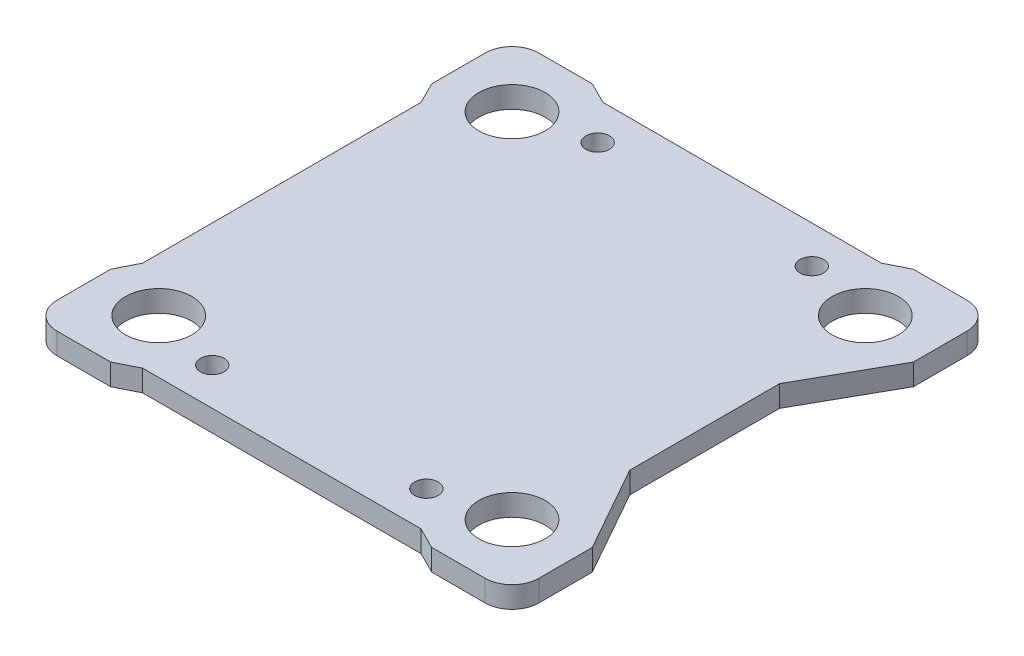
ISO-10303-21;
HEADER;
FILE_DESCRIPTION(('STEP AP214'),'2;1');
FILE_NAME('part.step','',(''),(''),'','','');
FILE_SCHEMA(('AUTOMOTIVE_DESIGN { 1 0 10303 214 1 1 1 1 }'));
ENDSEC;
DATA;
#1=APPLICATION_CONTEXT('core data for automotive mechanical design processes');
#2=APPLICATION_PROTOCOL_DEFINITION('international standard','automotive_design',2000,#1);
#3=PRODUCT_CONTEXT('',#1,'mechanical');
#4=PRODUCT('Part','Part','',(#3));
#5=PRODUCT_RELATED_PRODUCT_CATEGORY('part','',(#4));
#6=PRODUCT_DEFINITION_FORMATION('','',#4);
#7=PRODUCT_DEFINITION_CONTEXT('part definition',#1,'design');
#8=PRODUCT_DEFINITION('design','',#6,#7);
#9=PRODUCT_DEFINITION_SHAPE('','',#8);
#10=(LENGTH_UNIT() NAMED_UNIT(*) SI_UNIT(.MILLI.,.METRE.));
#11=(NAMED_UNIT(*) PLANE_ANGLE_UNIT() SI_UNIT($,.RADIAN.));
#12=(NAMED_UNIT(*) SI_UNIT($,.STERADIAN.) SOLID_ANGLE_UNIT());
#13=UNCERTAINTY_MEASURE_WITH_UNIT(LENGTH_MEASURE(1.E-05),#10,'distance_accuracy_value','');
#14=(GEOMETRIC_REPRESENTATION_CONTEXT(3) GLOBAL_UNCERTAINTY_ASSIGNED_CONTEXT((#13)) GLOBAL_UNIT_ASSIGNED_CONTEXT((#10,
#11,#12)) REPRESENTATION_CONTEXT('',''));
#15=CARTESIAN_POINT('',(0.,0.,0.));
#16=DIRECTION('',(0.,0.,1.));
#17=DIRECTION('',(1.,0.,0.));
#18=AXIS2_PLACEMENT_3D('',#15,#16,#17);
#19=CARTESIAN_POINT('',(0.,2.,0.));
#20=DIRECTION('',(0.,-1.,0.));
#21=DIRECTION('',(0.,0.,-1.));
#22=AXIS2_PLACEMENT_3D('',#19,#20,#21);
#23=PLANE('',#22);
#24=CARTESIAN_POINT('',(-8.2277397260271,2.,-12.4905821917808));
#25=DIRECTION('',(0.,1.,0.));
#26=DIRECTION('',(0.,0.,1.));
#27=AXIS2_PLACEMENT_3D('',#24,#25,#26);
#28=CIRCLE('',#27,1.09999999999999);
#29=CARTESIAN_POINT('',(-8.2277397260271,2.,-11.3905821917808));
#30=VERTEX_POINT('',#29);
#31=EDGE_CURVE('E514',#30,#30,#28,.T.);
#32=ORIENTED_EDGE('',*,*,#31,.F.);
#33=EDGE_LOOP('',(#32));
#34=FACE_BOUND('',#33,.T.);
#35=CARTESIAN_POINT('',(11.7722602739729,2.,-12.4905821917808));
#36=DIRECTION('',(0.,1.,0.));
#37=DIRECTION('',(0.,0.,1.));
#38=AXIS2_PLACEMENT_3D('',#35,#36,#37);
#39=CIRCLE('',#38,1.09999999999999);
#40=CARTESIAN_POINT('',(11.7722602739729,2.,-11.3905821917808));
#41=VERTEX_POINT('',#40);
#42=EDGE_CURVE('E508',#41,#41,#39,.T.);
#43=ORIENTED_EDGE('',*,*,#42,.F.);
#44=EDGE_LOOP('',(#43));
#45=FACE_BOUND('',#44,.T.);
#46=CARTESIAN_POINT('',(-8.2277397260271,2.,23.5094178082199));
#47=DIRECTION('',(0.,1.,0.));
#48=DIRECTION('',(0.,0.,1.));
#49=AXIS2_PLACEMENT_3D('',#46,#47,#48);
#50=CIRCLE('',#49,1.09999999999999);
#51=CARTESIAN_POINT('',(-8.2277397260271,2.,24.6094178082198));
#52=VERTEX_POINT('',#51);
#53=EDGE_CURVE('E502',#52,#52,#50,.T.);
#54=ORIENTED_EDGE('',*,*,#53,.F.);
#55=EDGE_LOOP('',(#54));
#56=FACE_BOUND('',#55,.T.);
#57=CARTESIAN_POINT('',(11.7722602739729,2.,23.5094178082199));
#58=DIRECTION('',(0.,1.,0.));
#59=DIRECTION('',(0.,0.,1.));
#60=AXIS2_PLACEMENT_3D('',#57,#58,#59);
#61=CIRCLE('',#60,1.09999999999999);
#62=CARTESIAN_POINT('',(11.7722602739729,2.,24.6094178082198));
#63=VERTEX_POINT('',#62);
#64=EDGE_CURVE('E496',#63,#63,#61,.T.);
#65=ORIENTED_EDGE('',*,*,#64,.F.);
#66=EDGE_LOOP('',(#65));
#67=FACE_BOUND('',#66,.T.);
#68=CARTESIAN_POINT('',(-14.7277397260274,2.,-10.9905821917808));
#69=DIRECTION('',(0.,1.,0.));
#70=DIRECTION('',(0.,0.,1.));
#71=AXIS2_PLACEMENT_3D('',#68,#69,#70);
#72=CIRCLE('',#71,3.1);
#73=CARTESIAN_POINT('',(-14.7277397260274,2.,-7.89058219178082));
#74=VERTEX_POINT('',#73);
#75=EDGE_CURVE('E338',#74,#74,#72,.T.);
#76=ORIENTED_EDGE('',*,*,#75,.F.);
#77=EDGE_LOOP('',(#76));
#78=FACE_BOUND('',#77,.T.);
#79=CARTESIAN_POINT('',(18.2722602739726,2.,-10.9905821917812));
#80=DIRECTION('',(0.,1.,0.));
#81=DIRECTION('',(0.,0.,1.));
#82=AXIS2_PLACEMENT_3D('',#79,#80,#81);
#83=CIRCLE('',#82,3.1);
#84=CARTESIAN_POINT('',(18.2722602739726,2.,-7.89058219178122));
#85=VERTEX_POINT('',#84);
#86=EDGE_CURVE('E339',#85,#85,#83,.T.);
#87=ORIENTED_EDGE('',*,*,#86,.F.);
#88=EDGE_LOOP('',(#87));
#89=FACE_BOUND('',#88,.T.);
#90=CARTESIAN_POINT('',(18.272260273973,2.,22.0094178082188));
#91=DIRECTION('',(0.,1.,0.));
#92=DIRECTION('',(0.,0.,1.));
#93=AXIS2_PLACEMENT_3D('',#90,#91,#92);
#94=CIRCLE('',#93,3.1);
#95=CARTESIAN_POINT('',(18.272260273973,2.,25.1094178082188));
#96=VERTEX_POINT('',#95);
#97=EDGE_CURVE('E345',#96,#96,#94,.T.);
#98=ORIENTED_EDGE('',*,*,#97,.F.);
#99=EDGE_LOOP('',(#98));
#100=FACE_BOUND('',#99,.T.);
#101=CARTESIAN_POINT('',(-14.7277397260271,2.,22.009417808219));
#102=DIRECTION('',(0.,1.,0.));
#103=DIRECTION('',(0.,0.,1.));
#104=AXIS2_PLACEMENT_3D('',#101,#102,#103);
#105=CIRCLE('',#104,3.1);
#106=CARTESIAN_POINT('',(-14.7277397260271,2.,25.109417808219));
#107=VERTEX_POINT('',#106);
#108=EDGE_CURVE('E351',#107,#107,#105,.T.);
#109=ORIENTED_EDGE('',*,*,#108,.F.);
#110=EDGE_LOOP('',(#109));
#111=FACE_BOUND('',#110,.T.);
#112=DIRECTION('',(0.490261239632588,0.,-0.871575537124533));
#113=VECTOR('',#112,1.);
#114=CARTESIAN_POINT('',(19.7722602739725,2.,-1.49058219178046));
#115=LINE('',#114,#113);
#116=CARTESIAN_POINT('',(19.7722602739725,2.,-1.49058219178046));
#117=VERTEX_POINT('',#116);
#118=CARTESIAN_POINT('',(24.2722602739728,2.,-9.49058219178045));
#119=VERTEX_POINT('',#118);
#120=EDGE_CURVE('E180',#117,#119,#115,.T.);
#121=ORIENTED_EDGE('',*,*,#120,.T.);
#122=DIRECTION('',(0.,0.,1.));
#123=VECTOR('',#122,1.);
#124=CARTESIAN_POINT('',(24.2722602739726,2.,-16.9905821917808));
#125=LINE('',#124,#123);
#126=CARTESIAN_POINT('',(24.2722602739726,2.,-14.4905821917808));
#127=VERTEX_POINT('',#126);
#128=EDGE_CURVE('E195',#127,#119,#125,.T.);
#129=ORIENTED_EDGE('',*,*,#128,.F.);
#130=CARTESIAN_POINT('',(21.7722602739726,2.,-14.4905821917808));
#131=DIRECTION('',(0.,-1.,0.));
#132=DIRECTION('',(0.,0.,-1.));
#133=AXIS2_PLACEMENT_3D('',#130,#131,#132);
#134=CIRCLE('',#133,2.5);
#135=CARTESIAN_POINT('',(21.7722602739726,2.,-16.9905821917808));
#136=VERTEX_POINT('',#135);
#137=EDGE_CURVE('E262',#127,#136,#134,.F.);
#138=ORIENTED_EDGE('',*,*,#137,.T.);
#139=DIRECTION('',(1.,0.,0.));
#140=VECTOR('',#139,1.);
#141=CARTESIAN_POINT('',(-20.7277397260274,2.,-16.9905821917808));
#142=LINE('',#141,#140);
#143=CARTESIAN_POINT('',(16.7722602739729,2.,-16.9905821917806));
#144=VERTEX_POINT('',#143);
#145=EDGE_CURVE('E206',#144,#136,#142,.T.);
#146=ORIENTED_EDGE('',*,*,#145,.F.);
#147=DIRECTION('',(0.89442719099992,0.,-0.44721359549995));
#148=VECTOR('',#147,1.);
#149=CARTESIAN_POINT('',(14.7722602739729,2.,-15.9905821917806));
#150=LINE('',#149,#148);
#151=CARTESIAN_POINT('',(14.7722602739729,2.,-15.9905821917806));
#152=VERTEX_POINT('',#151);
#153=EDGE_CURVE('E321',#152,#144,#150,.T.);
#154=ORIENTED_EDGE('',*,*,#153,.F.);
#155=DIRECTION('',(1.,0.,0.));
#156=VECTOR('',#155,1.);
#157=CARTESIAN_POINT('',(14.7722602739729,2.,-15.9905821917806));
#158=LINE('',#157,#156);
#159=CARTESIAN_POINT('',(-11.2277397260271,2.,-15.9905821917808));
#160=VERTEX_POINT('',#159);
#161=EDGE_CURVE('E188',#160,#152,#158,.T.);
#162=ORIENTED_EDGE('',*,*,#161,.F.);
#163=DIRECTION('',(0.894427190999913,0.,0.447213595499965));
#164=VECTOR('',#163,1.);
#165=CARTESIAN_POINT('',(-11.2277397260271,2.,-15.9905821917808));
#166=LINE('',#165,#164);
#167=CARTESIAN_POINT('',(-13.2277397260271,2.,-16.9905821917808));
#168=VERTEX_POINT('',#167);
#169=EDGE_CURVE('E312',#168,#160,#166,.T.);
#170=ORIENTED_EDGE('',*,*,#169,.F.);
#171=CARTESIAN_POINT('',(-18.2277397260274,2.,-16.9905821917808));
#172=VERTEX_POINT('',#171);
#173=EDGE_CURVE('E209',#172,#168,#142,.T.);
#174=ORIENTED_EDGE('',*,*,#173,.F.);
#175=CARTESIAN_POINT('',(-18.2277397260274,2.,-14.4905821917808));
#176=DIRECTION('',(0.,-1.,0.));
#177=DIRECTION('',(0.,0.,-1.));
#178=AXIS2_PLACEMENT_3D('',#175,#176,#177);
#179=CIRCLE('',#178,2.5);
#180=CARTESIAN_POINT('',(-20.7277397260274,2.,-14.4905821917808));
#181=VERTEX_POINT('',#180);
#182=EDGE_CURVE('E255',#172,#181,#179,.F.);
#183=ORIENTED_EDGE('',*,*,#182,.T.);
#184=DIRECTION('',(0.,0.,1.));
#185=VECTOR('',#184,1.);
#186=CARTESIAN_POINT('',(-20.7277397260274,2.,-16.9905821917808));
#187=LINE('',#186,#185);
#188=CARTESIAN_POINT('',(-20.7277397260271,2.,-9.4905821917809));
#189=VERTEX_POINT('',#188);
#190=EDGE_CURVE('E217',#181,#189,#187,.T.);
#191=ORIENTED_EDGE('',*,*,#190,.T.);
#192=DIRECTION('',(-0.447213595499953,0.,-0.894427190999919));
#193=VECTOR('',#192,1.);
#194=CARTESIAN_POINT('',(-19.7277397260272,2.,-7.4905821917809));
#195=LINE('',#194,#193);
#196=CARTESIAN_POINT('',(-19.7277397260272,2.,-7.4905821917809));
#197=VERTEX_POINT('',#196);
#198=EDGE_CURVE('E296',#197,#189,#195,.T.);
#199=ORIENTED_EDGE('',*,*,#198,.F.);
#200=DIRECTION('',(0.,0.,-1.));
#201=VECTOR('',#200,1.);
#202=CARTESIAN_POINT('',(-19.7277397260272,2.,-7.4905821917809));
#203=LINE('',#202,#201);
#204=CARTESIAN_POINT('',(-19.7277397260273,2.,18.5094178082191));
#205=VERTEX_POINT('',#204);
#206=EDGE_CURVE('E293',#205,#197,#203,.T.);
#207=ORIENTED_EDGE('',*,*,#206,.F.);
#208=DIRECTION('',(0.447213595499962,0.,-0.894427190999914));
#209=VECTOR('',#208,1.);
#210=CARTESIAN_POINT('',(-19.7277397260273,2.,18.5094178082191));
#211=LINE('',#210,#209);
#212=CARTESIAN_POINT('',(-20.7277397260273,2.,20.5094178082191));
#213=VERTEX_POINT('',#212);
#214=EDGE_CURVE('E289',#213,#205,#211,.T.);
#215=ORIENTED_EDGE('',*,*,#214,.F.);
#216=CARTESIAN_POINT('',(-20.7277397260274,2.,25.5094178082192));
#217=VERTEX_POINT('',#216);
#218=EDGE_CURVE('E216',#213,#217,#187,.T.);
#219=ORIENTED_EDGE('',*,*,#218,.T.);
#220=CARTESIAN_POINT('',(-18.2277397260274,2.,25.5094178082192));
#221=DIRECTION('',(0.,-1.,0.));
#222=DIRECTION('',(0.,0.,-1.));
#223=AXIS2_PLACEMENT_3D('',#220,#221,#222);
#224=CIRCLE('',#223,2.5);
#225=CARTESIAN_POINT('',(-18.2277397260274,2.,28.0094178082192));
#226=VERTEX_POINT('',#225);
#227=EDGE_CURVE('E257',#217,#226,#224,.F.);
#228=ORIENTED_EDGE('',*,*,#227,.T.);
#229=DIRECTION('',(1.,0.,0.));
#230=VECTOR('',#229,1.);
#231=CARTESIAN_POINT('',(-20.7277397260274,2.,28.0094178082192));
#232=LINE('',#231,#230);
#233=CARTESIAN_POINT('',(-13.2277397260274,2.,28.0094178082192));
#234=VERTEX_POINT('',#233);
#235=EDGE_CURVE('E211',#226,#234,#232,.T.);
#236=ORIENTED_EDGE('',*,*,#235,.T.);
#237=DIRECTION('',(-0.894427190999917,0.,0.447213595499956));
#238=VECTOR('',#237,1.);
#239=CARTESIAN_POINT('',(-11.2277397260274,2.,27.0094178082192));
#240=LINE('',#239,#238);
#241=CARTESIAN_POINT('',(-11.2277397260274,2.,27.0094178082192));
#242=VERTEX_POINT('',#241);
#243=EDGE_CURVE('E472',#242,#234,#240,.T.);
#244=ORIENTED_EDGE('',*,*,#243,.F.);
#245=DIRECTION('',(-1.,0.,0.));
#246=VECTOR('',#245,1.);
#247=CARTESIAN_POINT('',(-11.2277397260274,2.,27.0094178082192));
#248=LINE('',#247,#246);
#249=CARTESIAN_POINT('',(14.7722602739726,2.,27.0094178082192));
#250=VERTEX_POINT('',#249);
#251=EDGE_CURVE('E478',#250,#242,#248,.T.);
#252=ORIENTED_EDGE('',*,*,#251,.F.);
#253=DIRECTION('',(-0.894427190999916,0.,-0.447213595499959));
#254=VECTOR('',#253,1.);
#255=CARTESIAN_POINT('',(14.7722602739726,2.,27.0094178082192));
#256=LINE('',#255,#254);
#257=CARTESIAN_POINT('',(16.7722602739726,2.,28.0094178082192));
#258=VERTEX_POINT('',#257);
#259=EDGE_CURVE('E303',#258,#250,#256,.T.);
#260=ORIENTED_EDGE('',*,*,#259,.F.);
#261=CARTESIAN_POINT('',(21.7722602739726,2.,28.0094178082192));
#262=VERTEX_POINT('',#261);
#263=EDGE_CURVE('E236',#258,#262,#232,.T.);
#264=ORIENTED_EDGE('',*,*,#263,.T.);
#265=CARTESIAN_POINT('',(21.7722602739726,2.,25.5094178082192));
#266=DIRECTION('',(0.,-1.,0.));
#267=DIRECTION('',(0.,0.,-1.));
#268=AXIS2_PLACEMENT_3D('',#265,#266,#267);
#269=CIRCLE('',#268,2.5);
#270=CARTESIAN_POINT('',(24.2722602739726,2.,25.5094178082192));
#271=VERTEX_POINT('',#270);
#272=EDGE_CURVE('E259',#262,#271,#269,.F.);
#273=ORIENTED_EDGE('',*,*,#272,.T.);
#274=CARTESIAN_POINT('',(24.2722602739724,2.,20.5094178082195));
#275=VERTEX_POINT('',#274);
#276=EDGE_CURVE('E207',#275,#271,#125,.T.);
#277=ORIENTED_EDGE('',*,*,#276,.F.);
#278=DIRECTION('',(-0.490261239632556,0.,-0.871575537124551));
#279=VECTOR('',#278,1.);
#280=CARTESIAN_POINT('',(24.2722602739724,2.,20.5094178082195));
#281=LINE('',#280,#279);
#282=CARTESIAN_POINT('',(19.7722602739725,2.,12.5094178082195));
#283=VERTEX_POINT('',#282);
#284=EDGE_CURVE('E200',#275,#283,#281,.T.);
#285=ORIENTED_EDGE('',*,*,#284,.T.);
#286=DIRECTION('',(0.,0.,-1.));
#287=VECTOR('',#286,1.);
#288=CARTESIAN_POINT('',(19.7722602739725,2.,12.5094178082195));
#289=LINE('',#288,#287);
#290=EDGE_CURVE('E199',#283,#117,#289,.T.);
#291=ORIENTED_EDGE('',*,*,#290,.T.);
#292=EDGE_LOOP('',(#121,#129,#138,#146,#154,#162,#170,#174,#183,#191,#199,#207,#215,#219,#228,
#236,#244,#252,#260,#264,#273,#277,#285,#291));
#293=FACE_BOUND('',#292,.T.);
#294=ADVANCED_FACE('F16',(#34,#45,#56,#67,#78,#89,#100,#111,#293),#23,.F.);
#295=CARTESIAN_POINT('',(0.,0.,0.));
#296=DIRECTION('',(0.,-1.,0.));
#297=DIRECTION('',(0.,0.,-1.));
#298=AXIS2_PLACEMENT_3D('',#295,#296,#297);
#299=PLANE('',#298);
#300=CARTESIAN_POINT('',(-8.2277397260271,0.,-12.4905821917808));
#301=DIRECTION('',(0.,1.,0.));
#302=DIRECTION('',(0.,0.,1.));
#303=AXIS2_PLACEMENT_3D('',#300,#301,#302);
#304=CIRCLE('',#303,1.1);
#305=CARTESIAN_POINT('',(-8.2277397260271,0.,-11.3905821917808));
#306=VERTEX_POINT('',#305);
#307=EDGE_CURVE('E511',#306,#306,#304,.T.);
#308=ORIENTED_EDGE('',*,*,#307,.T.);
#309=EDGE_LOOP('',(#308));
#310=FACE_BOUND('',#309,.T.);
#311=CARTESIAN_POINT('',(11.7722602739729,0.,-12.4905821917808));
#312=DIRECTION('',(0.,1.,0.));
#313=DIRECTION('',(0.,0.,1.));
#314=AXIS2_PLACEMENT_3D('',#311,#312,#313);
#315=CIRCLE('',#314,1.1);
#316=CARTESIAN_POINT('',(11.7722602739729,0.,-11.3905821917808));
#317=VERTEX_POINT('',#316);
#318=EDGE_CURVE('E505',#317,#317,#315,.T.);
#319=ORIENTED_EDGE('',*,*,#318,.T.);
#320=EDGE_LOOP('',(#319));
#321=FACE_BOUND('',#320,.T.);
#322=CARTESIAN_POINT('',(-8.2277397260271,0.,23.5094178082199));
#323=DIRECTION('',(0.,1.,0.));
#324=DIRECTION('',(0.,0.,1.));
#325=AXIS2_PLACEMENT_3D('',#322,#323,#324);
#326=CIRCLE('',#325,1.1);
#327=CARTESIAN_POINT('',(-8.2277397260271,0.,24.6094178082198));
#328=VERTEX_POINT('',#327);
#329=EDGE_CURVE('E499',#328,#328,#326,.T.);
#330=ORIENTED_EDGE('',*,*,#329,.T.);
#331=EDGE_LOOP('',(#330));
#332=FACE_BOUND('',#331,.T.);
#333=CARTESIAN_POINT('',(11.7722602739729,0.,23.5094178082199));
#334=DIRECTION('',(0.,1.,0.));
#335=DIRECTION('',(0.,0.,1.));
#336=AXIS2_PLACEMENT_3D('',#333,#334,#335);
#337=CIRCLE('',#336,1.1);
#338=CARTESIAN_POINT('',(11.7722602739729,0.,24.6094178082198));
#339=VERTEX_POINT('',#338);
#340=EDGE_CURVE('E201',#339,#339,#337,.T.);
#341=ORIENTED_EDGE('',*,*,#340,.T.);
#342=EDGE_LOOP('',(#341));
#343=FACE_BOUND('',#342,.T.);
#344=CARTESIAN_POINT('',(-14.7277397260271,0.,22.009417808219));
#345=DIRECTION('',(0.,1.,0.));
#346=DIRECTION('',(0.,0.,1.));
#347=AXIS2_PLACEMENT_3D('',#344,#345,#346);
#348=CIRCLE('',#347,3.1);
#349=CARTESIAN_POINT('',(-14.7277397260271,0.,25.109417808219));
#350=VERTEX_POINT('',#349);
#351=EDGE_CURVE('E348',#350,#350,#348,.T.);
#352=ORIENTED_EDGE('',*,*,#351,.T.);
#353=EDGE_LOOP('',(#352));
#354=FACE_BOUND('',#353,.T.);
#355=CARTESIAN_POINT('',(18.272260273973,0.,22.0094178082188));
#356=DIRECTION('',(0.,1.,0.));
#357=DIRECTION('',(0.,0.,1.));
#358=AXIS2_PLACEMENT_3D('',#355,#356,#357);
#359=CIRCLE('',#358,3.1);
#360=CARTESIAN_POINT('',(18.272260273973,0.,25.1094178082188));
#361=VERTEX_POINT('',#360);
#362=EDGE_CURVE('E342',#361,#361,#359,.T.);
#363=ORIENTED_EDGE('',*,*,#362,.T.);
#364=EDGE_LOOP('',(#363));
#365=FACE_BOUND('',#364,.T.);
#366=CARTESIAN_POINT('',(18.2722602739726,0.,-10.9905821917812));
#367=DIRECTION('',(0.,1.,0.));
#368=DIRECTION('',(0.,0.,1.));
#369=AXIS2_PLACEMENT_3D('',#366,#367,#368);
#370=CIRCLE('',#369,3.1);
#371=CARTESIAN_POINT('',(18.2722602739726,0.,-7.89058219178122));
#372=VERTEX_POINT('',#371);
#373=EDGE_CURVE('E335',#372,#372,#370,.T.);
#374=ORIENTED_EDGE('',*,*,#373,.T.);
#375=EDGE_LOOP('',(#374));
#376=FACE_BOUND('',#375,.T.);
#377=CARTESIAN_POINT('',(-14.7277397260274,0.,-10.9905821917808));
#378=DIRECTION('',(0.,1.,0.));
#379=DIRECTION('',(0.,0.,1.));
#380=AXIS2_PLACEMENT_3D('',#377,#378,#379);
#381=CIRCLE('',#380,3.1);
#382=CARTESIAN_POINT('',(-14.7277397260274,0.,-7.89058219178082));
#383=VERTEX_POINT('',#382);
#384=EDGE_CURVE('E355',#383,#383,#381,.T.);
#385=ORIENTED_EDGE('',*,*,#384,.T.);
#386=EDGE_LOOP('',(#385));
#387=FACE_BOUND('',#386,.T.);
#388=DIRECTION('',(0.,0.,1.));
#389=VECTOR('',#388,1.);
#390=CARTESIAN_POINT('',(24.2722602739726,0.,-16.9905821917808));
#391=LINE('',#390,#389);
#392=CARTESIAN_POINT('',(24.2722602739726,0.,-14.4905821917808));
#393=VERTEX_POINT('',#392);
#394=CARTESIAN_POINT('',(24.2722602739728,0.,-9.49058219178045));
#395=VERTEX_POINT('',#394);
#396=EDGE_CURVE('E226',#393,#395,#391,.T.);
#397=ORIENTED_EDGE('',*,*,#396,.T.);
#398=DIRECTION('',(-0.490261239632588,0.,0.871575537124533));
#399=VECTOR('',#398,1.);
#400=CARTESIAN_POINT('',(14.3829519125233,0.,8.090410450795));
#401=LINE('',#400,#399);
#402=CARTESIAN_POINT('',(19.7722602739725,0.,-1.49058219178046));
#403=VERTEX_POINT('',#402);
#404=EDGE_CURVE('E183',#395,#403,#401,.T.);
#405=ORIENTED_EDGE('',*,*,#404,.T.);
#406=DIRECTION('',(0.,0.,-1.));
#407=VECTOR('',#406,1.);
#408=CARTESIAN_POINT('',(19.7722602739725,0.,12.5094178082195));
#409=LINE('',#408,#407);
#410=CARTESIAN_POINT('',(19.7722602739725,0.,12.5094178082195));
#411=VERTEX_POINT('',#410);
#412=EDGE_CURVE('E461',#411,#403,#409,.T.);
#413=ORIENTED_EDGE('',*,*,#412,.F.);
#414=DIRECTION('',(0.490261239632556,0.,0.871575537124551));
#415=VECTOR('',#414,1.);
#416=CARTESIAN_POINT('',(9.67460672330372,0.,-5.44196628185831));
#417=LINE('',#416,#415);
#418=CARTESIAN_POINT('',(24.2722602739724,0.,20.5094178082195));
#419=VERTEX_POINT('',#418);
#420=EDGE_CURVE('E453',#411,#419,#417,.T.);
#421=ORIENTED_EDGE('',*,*,#420,.T.);
#422=CARTESIAN_POINT('',(24.2722602739726,0.,25.5094178082192));
#423=VERTEX_POINT('',#422);
#424=EDGE_CURVE('E224',#419,#423,#391,.T.);
#425=ORIENTED_EDGE('',*,*,#424,.T.);
#426=CARTESIAN_POINT('',(21.7722602739726,0.,25.5094178082192));
#427=DIRECTION('',(0.,-1.,0.));
#428=DIRECTION('',(0.,0.,-1.));
#429=AXIS2_PLACEMENT_3D('',#426,#427,#428);
#430=CIRCLE('',#429,2.5);
#431=CARTESIAN_POINT('',(21.7722602739726,0.,28.0094178082192));
#432=VERTEX_POINT('',#431);
#433=EDGE_CURVE('E246',#423,#432,#430,.T.);
#434=ORIENTED_EDGE('',*,*,#433,.T.);
#435=DIRECTION('',(1.,0.,0.));
#436=VECTOR('',#435,1.);
#437=CARTESIAN_POINT('',(-20.7277397260274,0.,28.0094178082192));
#438=LINE('',#437,#436);
#439=CARTESIAN_POINT('',(16.7722602739726,0.,28.0094178082192));
#440=VERTEX_POINT('',#439);
#441=EDGE_CURVE('E225',#440,#432,#438,.T.);
#442=ORIENTED_EDGE('',*,*,#441,.F.);
#443=DIRECTION('',(-0.894427190999916,0.,-0.447213595499959));
#444=VECTOR('',#443,1.);
#445=CARTESIAN_POINT('',(14.7722602739726,0.,27.0094178082192));
#446=LINE('',#445,#444);
#447=CARTESIAN_POINT('',(14.7722602739726,0.,27.0094178082192));
#448=VERTEX_POINT('',#447);
#449=EDGE_CURVE('E468',#440,#448,#446,.T.);
#450=ORIENTED_EDGE('',*,*,#449,.T.);
#451=DIRECTION('',(-1.,0.,0.));
#452=VECTOR('',#451,1.);
#453=CARTESIAN_POINT('',(-11.2277397260274,0.,27.0094178082192));
#454=LINE('',#453,#452);
#455=CARTESIAN_POINT('',(-11.2277397260274,0.,27.0094178082192));
#456=VERTEX_POINT('',#455);
#457=EDGE_CURVE('E471',#448,#456,#454,.T.);
#458=ORIENTED_EDGE('',*,*,#457,.T.);
#459=DIRECTION('',(-0.894427190999917,0.,0.447213595499956));
#460=VECTOR('',#459,1.);
#461=CARTESIAN_POINT('',(-11.2277397260274,0.,27.0094178082192));
#462=LINE('',#461,#460);
#463=CARTESIAN_POINT('',(-13.2277397260274,0.,28.0094178082192));
#464=VERTEX_POINT('',#463);
#465=EDGE_CURVE('E31',#456,#464,#462,.T.);
#466=ORIENTED_EDGE('',*,*,#465,.T.);
#467=CARTESIAN_POINT('',(-18.2277397260274,0.,28.0094178082192));
#468=VERTEX_POINT('',#467);
#469=EDGE_CURVE('E221',#468,#464,#438,.T.);
#470=ORIENTED_EDGE('',*,*,#469,.F.);
#471=CARTESIAN_POINT('',(-18.2277397260274,0.,25.5094178082192));
#472=DIRECTION('',(0.,-1.,0.));
#473=DIRECTION('',(0.,0.,-1.));
#474=AXIS2_PLACEMENT_3D('',#471,#472,#473);
#475=CIRCLE('',#474,2.5);
#476=CARTESIAN_POINT('',(-20.7277397260274,0.,25.5094178082192));
#477=VERTEX_POINT('',#476);
#478=EDGE_CURVE('E243',#468,#477,#475,.T.);
#479=ORIENTED_EDGE('',*,*,#478,.T.);
#480=DIRECTION('',(0.,0.,1.));
#481=VECTOR('',#480,1.);
#482=CARTESIAN_POINT('',(-20.7277397260274,0.,-16.9905821917808));
#483=LINE('',#482,#481);
#484=CARTESIAN_POINT('',(-20.7277397260273,0.,20.5094178082191));
#485=VERTEX_POINT('',#484);
#486=EDGE_CURVE('E232',#485,#477,#483,.T.);
#487=ORIENTED_EDGE('',*,*,#486,.F.);
#488=DIRECTION('',(0.447213595499962,0.,-0.894427190999914));
#489=VECTOR('',#488,1.);
#490=CARTESIAN_POINT('',(-19.7277397260273,0.,18.5094178082191));
#491=LINE('',#490,#489);
#492=CARTESIAN_POINT('',(-19.7277397260273,0.,18.5094178082191));
#493=VERTEX_POINT('',#492);
#494=EDGE_CURVE('E285',#485,#493,#491,.T.);
#495=ORIENTED_EDGE('',*,*,#494,.T.);
#496=DIRECTION('',(0.,0.,-1.));
#497=VECTOR('',#496,1.);
#498=CARTESIAN_POINT('',(-19.7277397260272,0.,-7.4905821917809));
#499=LINE('',#498,#497);
#500=CARTESIAN_POINT('',(-19.7277397260272,0.,-7.4905821917809));
#501=VERTEX_POINT('',#500);
#502=EDGE_CURVE('E284',#493,#501,#499,.T.);
#503=ORIENTED_EDGE('',*,*,#502,.T.);
#504=DIRECTION('',(-0.447213595499953,0.,-0.894427190999919));
#505=VECTOR('',#504,1.);
#506=CARTESIAN_POINT('',(-19.7277397260272,0.,-7.4905821917809));
#507=LINE('',#506,#505);
#508=CARTESIAN_POINT('',(-20.7277397260274,0.,-9.49058219178139));
#509=VERTEX_POINT('',#508);
#510=EDGE_CURVE('E281',#501,#509,#507,.T.);
#511=ORIENTED_EDGE('',*,*,#510,.T.);
#512=CARTESIAN_POINT('',(-20.7277397260274,0.,-14.4905821917808));
#513=VERTEX_POINT('',#512);
#514=EDGE_CURVE('E233',#513,#509,#483,.T.);
#515=ORIENTED_EDGE('',*,*,#514,.F.);
#516=CARTESIAN_POINT('',(-18.2277397260274,0.,-14.4905821917808));
#517=DIRECTION('',(0.,-1.,0.));
#518=DIRECTION('',(0.,0.,-1.));
#519=AXIS2_PLACEMENT_3D('',#516,#517,#518);
#520=CIRCLE('',#519,2.5);
#521=CARTESIAN_POINT('',(-18.2277397260274,0.,-16.9905821917808));
#522=VERTEX_POINT('',#521);
#523=EDGE_CURVE('E241',#513,#522,#520,.T.);
#524=ORIENTED_EDGE('',*,*,#523,.T.);
#525=DIRECTION('',(1.,0.,0.));
#526=VECTOR('',#525,1.);
#527=CARTESIAN_POINT('',(-20.7277397260274,0.,-16.9905821917808));
#528=LINE('',#527,#526);
#529=CARTESIAN_POINT('',(-13.2277397260271,0.,-16.9905821917808));
#530=VERTEX_POINT('',#529);
#531=EDGE_CURVE('E229',#522,#530,#528,.T.);
#532=ORIENTED_EDGE('',*,*,#531,.T.);
#533=DIRECTION('',(0.894427190999913,0.,0.447213595499965));
#534=VECTOR('',#533,1.);
#535=CARTESIAN_POINT('',(-11.2277397260271,0.,-15.9905821917808));
#536=LINE('',#535,#534);
#537=CARTESIAN_POINT('',(-11.2277397260271,0.,-15.9905821917808));
#538=VERTEX_POINT('',#537);
#539=EDGE_CURVE('E315',#530,#538,#536,.T.);
#540=ORIENTED_EDGE('',*,*,#539,.T.);
#541=DIRECTION('',(1.,0.,0.));
#542=VECTOR('',#541,1.);
#543=CARTESIAN_POINT('',(14.7722602739729,0.,-15.9905821917806));
#544=LINE('',#543,#542);
#545=CARTESIAN_POINT('',(14.7722602739729,0.,-15.9905821917806));
#546=VERTEX_POINT('',#545);
#547=EDGE_CURVE('E308',#538,#546,#544,.T.);
#548=ORIENTED_EDGE('',*,*,#547,.T.);
#549=DIRECTION('',(0.89442719099992,0.,-0.44721359549995));
#550=VECTOR('',#549,1.);
#551=CARTESIAN_POINT('',(14.7722602739729,0.,-15.9905821917806));
#552=LINE('',#551,#550);
#553=CARTESIAN_POINT('',(16.7722602739734,0.,-16.9905821917808));
#554=VERTEX_POINT('',#553);
#555=EDGE_CURVE('E311',#546,#554,#552,.T.);
#556=ORIENTED_EDGE('',*,*,#555,.T.);
#557=CARTESIAN_POINT('',(21.7722602739726,0.,-16.9905821917808));
#558=VERTEX_POINT('',#557);
#559=EDGE_CURVE('E228',#554,#558,#528,.T.);
#560=ORIENTED_EDGE('',*,*,#559,.T.);
#561=CARTESIAN_POINT('',(21.7722602739726,0.,-14.4905821917808));
#562=DIRECTION('',(0.,-1.,0.));
#563=DIRECTION('',(0.,0.,-1.));
#564=AXIS2_PLACEMENT_3D('',#561,#562,#563);
#565=CIRCLE('',#564,2.5);
#566=EDGE_CURVE('E249',#558,#393,#565,.T.);
#567=ORIENTED_EDGE('',*,*,#566,.T.);
#568=EDGE_LOOP('',(#397,#405,#413,#421,#425,#434,#442,#450,#458,#466,#470,#479,#487,#495,#503,
#511,#515,#524,#532,#540,#548,#556,#560,#567));
#569=FACE_BOUND('',#568,.T.);
#570=ADVANCED_FACE('F278',(#310,#321,#332,#343,#354,#365,#376,#387,#569),#299,.T.);
#571=CARTESIAN_POINT('',(-20.7277397260274,2.,28.0094178082192));
#572=DIRECTION('',(0.,0.,-1.));
#573=DIRECTION('',(-1.,0.,0.));
#574=AXIS2_PLACEMENT_3D('',#571,#572,#573);
#575=PLANE('',#574);
#576=ORIENTED_EDGE('',*,*,#263,.F.);
#577=DIRECTION('',(0.,1.,0.));
#578=VECTOR('',#577,1.);
#579=CARTESIAN_POINT('',(16.7722602739726,0.,28.0094178082192));
#580=LINE('',#579,#578);
#581=EDGE_CURVE('E354',#440,#258,#580,.T.);
#582=ORIENTED_EDGE('',*,*,#581,.F.);
#583=ORIENTED_EDGE('',*,*,#441,.T.);
#584=DIRECTION('',(0.,-1.,0.));
#585=VECTOR('',#584,1.);
#586=CARTESIAN_POINT('',(21.7722602739726,2.,28.0094178082192));
#587=LINE('',#586,#585);
#588=EDGE_CURVE('E267',#432,#262,#587,.F.);
#589=ORIENTED_EDGE('',*,*,#588,.T.);
#590=EDGE_LOOP('',(#576,#582,#583,#589));
#591=FACE_BOUND('',#590,.T.);
#592=ADVANCED_FACE('F399',(#591),#575,.F.);
#593=CARTESIAN_POINT('',(24.2722602739726,2.,-16.9905821917808));
#594=DIRECTION('',(1.,0.,0.));
#595=DIRECTION('',(0.,0.,-1.));
#596=AXIS2_PLACEMENT_3D('',#593,#594,#595);
#597=PLANE('',#596);
#598=DIRECTION('',(0.,1.,0.));
#599=VECTOR('',#598,1.);
#600=CARTESIAN_POINT('',(24.2722602739728,0.,-9.49058219178045));
#601=LINE('',#600,#599);
#602=EDGE_CURVE('E177',#395,#119,#601,.T.);
#603=ORIENTED_EDGE('',*,*,#602,.F.);
#604=ORIENTED_EDGE('',*,*,#396,.F.);
#605=DIRECTION('',(0.,-1.,0.));
#606=VECTOR('',#605,1.);
#607=CARTESIAN_POINT('',(24.2722602739726,2.,-14.4905821917808));
#608=LINE('',#607,#606);
#609=EDGE_CURVE('E205',#393,#127,#608,.F.);
#610=ORIENTED_EDGE('',*,*,#609,.T.);
#611=ORIENTED_EDGE('',*,*,#128,.T.);
#612=EDGE_LOOP('',(#603,#604,#610,#611));
#613=FACE_BOUND('',#612,.T.);
#614=ADVANCED_FACE('F203',(#613),#597,.T.);
#615=CARTESIAN_POINT('',(-20.7277397260274,2.,-16.9905821917808));
#616=DIRECTION('',(0.,0.,-1.));
#617=DIRECTION('',(-1.,0.,0.));
#618=AXIS2_PLACEMENT_3D('',#615,#616,#617);
#619=PLANE('',#618);
#620=DIRECTION('',(0.,1.,0.));
#621=VECTOR('',#620,1.);
#622=CARTESIAN_POINT('',(-13.2277397260271,0.,-16.9905821917808));
#623=LINE('',#622,#621);
#624=EDGE_CURVE('E326',#530,#168,#623,.T.);
#625=ORIENTED_EDGE('',*,*,#624,.F.);
#626=ORIENTED_EDGE('',*,*,#531,.F.);
#627=DIRECTION('',(0.,-1.,0.));
#628=VECTOR('',#627,1.);
#629=CARTESIAN_POINT('',(-18.2277397260274,2.,-16.9905821917808));
#630=LINE('',#629,#628);
#631=EDGE_CURVE('E220',#522,#172,#630,.F.);
#632=ORIENTED_EDGE('',*,*,#631,.T.);
#633=ORIENTED_EDGE('',*,*,#173,.T.);
#634=EDGE_LOOP('',(#625,#626,#632,#633));
#635=FACE_BOUND('',#634,.T.);
#636=ADVANCED_FACE('F409',(#635),#619,.T.);
#637=CARTESIAN_POINT('',(-20.7277397260274,2.,-16.9905821917808));
#638=DIRECTION('',(1.,0.,0.));
#639=DIRECTION('',(0.,0.,-1.));
#640=AXIS2_PLACEMENT_3D('',#637,#638,#639);
#641=PLANE('',#640);
#642=ORIENTED_EDGE('',*,*,#218,.F.);
#643=DIRECTION('',(0.,1.,0.));
#644=VECTOR('',#643,1.);
#645=CARTESIAN_POINT('',(-20.7277397260273,0.,20.5094178082191));
#646=LINE('',#645,#644);
#647=EDGE_CURVE('E304',#485,#213,#646,.T.);
#648=ORIENTED_EDGE('',*,*,#647,.F.);
#649=ORIENTED_EDGE('',*,*,#486,.T.);
#650=DIRECTION('',(0.,-1.,0.));
#651=VECTOR('',#650,1.);
#652=CARTESIAN_POINT('',(-20.7277397260274,2.,25.5094178082192));
#653=LINE('',#652,#651);
#654=EDGE_CURVE('E11',#477,#217,#653,.F.);
#655=ORIENTED_EDGE('',*,*,#654,.T.);
#656=EDGE_LOOP('',(#642,#648,#649,#655));
#657=FACE_BOUND('',#656,.T.);
#658=ADVANCED_FACE('F404',(#657),#641,.F.);
#659=ORIENTED_EDGE('',*,*,#469,.T.);
#660=DIRECTION('',(0.,1.,0.));
#661=VECTOR('',#660,1.);
#662=CARTESIAN_POINT('',(-13.2277397260274,0.,28.0094178082192));
#663=LINE('',#662,#661);
#664=EDGE_CURVE('E438',#464,#234,#663,.T.);
#665=ORIENTED_EDGE('',*,*,#664,.T.);
#666=ORIENTED_EDGE('',*,*,#235,.F.);
#667=DIRECTION('',(0.,-1.,0.));
#668=VECTOR('',#667,1.);
#669=CARTESIAN_POINT('',(-18.2277397260274,2.,28.0094178082192));
#670=LINE('',#669,#668);
#671=EDGE_CURVE('E264',#226,#468,#670,.T.);
#672=ORIENTED_EDGE('',*,*,#671,.T.);
#673=EDGE_LOOP('',(#659,#665,#666,#672));
#674=FACE_BOUND('',#673,.T.);
#675=ADVANCED_FACE('F412',(#674),#575,.F.);
#676=DIRECTION('',(0.,1.,0.));
#677=VECTOR('',#676,1.);
#678=CARTESIAN_POINT('',(24.2722602739724,0.,20.5094178082195));
#679=LINE('',#678,#677);
#680=EDGE_CURVE('E189',#419,#275,#679,.T.);
#681=ORIENTED_EDGE('',*,*,#680,.T.);
#682=ORIENTED_EDGE('',*,*,#276,.T.);
#683=DIRECTION('',(0.,-1.,0.));
#684=VECTOR('',#683,1.);
#685=CARTESIAN_POINT('',(24.2722602739726,0.,25.5094178082192));
#686=LINE('',#685,#684);
#687=EDGE_CURVE('E251',#271,#423,#686,.T.);
#688=ORIENTED_EDGE('',*,*,#687,.T.);
#689=ORIENTED_EDGE('',*,*,#424,.F.);
#690=EDGE_LOOP('',(#681,#682,#688,#689));
#691=FACE_BOUND('',#690,.T.);
#692=ADVANCED_FACE('F407',(#691),#597,.T.);
#693=DIRECTION('',(0.,1.,0.));
#694=VECTOR('',#693,1.);
#695=CARTESIAN_POINT('',(16.7722602739729,0.,-16.9905821917806));
#696=LINE('',#695,#694);
#697=EDGE_CURVE('E328',#554,#144,#696,.T.);
#698=ORIENTED_EDGE('',*,*,#697,.T.);
#699=ORIENTED_EDGE('',*,*,#145,.T.);
#700=DIRECTION('',(0.,-1.,0.));
#701=VECTOR('',#700,1.);
#702=CARTESIAN_POINT('',(21.7722602739726,2.,-16.9905821917808));
#703=LINE('',#702,#701);
#704=EDGE_CURVE('E238',#136,#558,#703,.T.);
#705=ORIENTED_EDGE('',*,*,#704,.T.);
#706=ORIENTED_EDGE('',*,*,#559,.F.);
#707=EDGE_LOOP('',(#698,#699,#705,#706));
#708=FACE_BOUND('',#707,.T.);
#709=ADVANCED_FACE('F403',(#708),#619,.T.);
#710=ORIENTED_EDGE('',*,*,#514,.T.);
#711=DIRECTION('',(0.,1.,0.));
#712=VECTOR('',#711,1.);
#713=CARTESIAN_POINT('',(-20.7277397260271,0.,-9.4905821917809));
#714=LINE('',#713,#712);
#715=EDGE_CURVE('E39',#509,#189,#714,.T.);
#716=ORIENTED_EDGE('',*,*,#715,.T.);
#717=ORIENTED_EDGE('',*,*,#190,.F.);
#718=DIRECTION('',(0.,-1.,0.));
#719=VECTOR('',#718,1.);
#720=CARTESIAN_POINT('',(-20.7277397260274,0.,-14.4905821917808));
#721=LINE('',#720,#719);
#722=EDGE_CURVE('E24',#181,#513,#721,.T.);
#723=ORIENTED_EDGE('',*,*,#722,.T.);
#724=EDGE_LOOP('',(#710,#716,#717,#723));
#725=FACE_BOUND('',#724,.T.);
#726=ADVANCED_FACE('F274',(#725),#641,.F.);
#727=CARTESIAN_POINT('',(-14.7277397260274,0.,-10.9905821917808));
#728=DIRECTION('',(0.,1.,0.));
#729=DIRECTION('',(0.,0.,1.));
#730=AXIS2_PLACEMENT_3D('',#727,#728,#729);
#731=CYLINDRICAL_SURFACE('',#730,3.1);
#732=ORIENTED_EDGE('',*,*,#384,.F.);
#733=EDGE_LOOP('',(#732));
#734=FACE_BOUND('',#733,.T.);
#735=ORIENTED_EDGE('',*,*,#75,.T.);
#736=EDGE_LOOP('',(#735));
#737=FACE_BOUND('',#736,.T.);
#738=ADVANCED_FACE('F360',(#734,#737),#731,.F.);
#739=CARTESIAN_POINT('',(18.2722602739726,0.,-10.9905821917812));
#740=DIRECTION('',(0.,1.,0.));
#741=DIRECTION('',(0.,0.,1.));
#742=AXIS2_PLACEMENT_3D('',#739,#740,#741);
#743=CYLINDRICAL_SURFACE('',#742,3.1);
#744=ORIENTED_EDGE('',*,*,#373,.F.);
#745=EDGE_LOOP('',(#744));
#746=FACE_BOUND('',#745,.T.);
#747=ORIENTED_EDGE('',*,*,#86,.T.);
#748=EDGE_LOOP('',(#747));
#749=FACE_BOUND('',#748,.T.);
#750=ADVANCED_FACE('F388',(#746,#749),#743,.F.);
#751=CARTESIAN_POINT('',(18.272260273973,0.,22.0094178082188));
#752=DIRECTION('',(0.,1.,0.));
#753=DIRECTION('',(0.,0.,1.));
#754=AXIS2_PLACEMENT_3D('',#751,#752,#753);
#755=CYLINDRICAL_SURFACE('',#754,3.1);
#756=ORIENTED_EDGE('',*,*,#362,.F.);
#757=EDGE_LOOP('',(#756));
#758=FACE_BOUND('',#757,.T.);
#759=ORIENTED_EDGE('',*,*,#97,.T.);
#760=EDGE_LOOP('',(#759));
#761=FACE_BOUND('',#760,.T.);
#762=ADVANCED_FACE('F375',(#758,#761),#755,.F.);
#763=CARTESIAN_POINT('',(-14.7277397260271,0.,22.009417808219));
#764=DIRECTION('',(0.,1.,0.));
#765=DIRECTION('',(0.,0.,1.));
#766=AXIS2_PLACEMENT_3D('',#763,#764,#765);
#767=CYLINDRICAL_SURFACE('',#766,3.1);
#768=ORIENTED_EDGE('',*,*,#351,.F.);
#769=EDGE_LOOP('',(#768));
#770=FACE_BOUND('',#769,.T.);
#771=ORIENTED_EDGE('',*,*,#108,.T.);
#772=EDGE_LOOP('',(#771));
#773=FACE_BOUND('',#772,.T.);
#774=ADVANCED_FACE('F372',(#770,#773),#767,.F.);
#775=CARTESIAN_POINT('',(21.7722602739726,2.,-14.4905821917808));
#776=DIRECTION('',(0.,-1.,0.));
#777=DIRECTION('',(0.,0.,-1.));
#778=AXIS2_PLACEMENT_3D('',#775,#776,#777);
#779=CYLINDRICAL_SURFACE('',#778,2.5);
#780=ORIENTED_EDGE('',*,*,#137,.F.);
#781=ORIENTED_EDGE('',*,*,#609,.F.);
#782=ORIENTED_EDGE('',*,*,#566,.F.);
#783=ORIENTED_EDGE('',*,*,#704,.F.);
#784=EDGE_LOOP('',(#780,#781,#782,#783));
#785=FACE_BOUND('',#784,.T.);
#786=ADVANCED_FACE('F374',(#785),#779,.T.);
#787=CARTESIAN_POINT('',(21.7722602739726,2.,25.5094178082192));
#788=DIRECTION('',(0.,1.,0.));
#789=DIRECTION('',(0.,0.,1.));
#790=AXIS2_PLACEMENT_3D('',#787,#788,#789);
#791=CYLINDRICAL_SURFACE('',#790,2.5);
#792=ORIENTED_EDGE('',*,*,#272,.F.);
#793=ORIENTED_EDGE('',*,*,#588,.F.);
#794=ORIENTED_EDGE('',*,*,#433,.F.);
#795=ORIENTED_EDGE('',*,*,#687,.F.);
#796=EDGE_LOOP('',(#792,#793,#794,#795));
#797=FACE_BOUND('',#796,.T.);
#798=ADVANCED_FACE('F385',(#797),#791,.T.);
#799=CARTESIAN_POINT('',(-18.2277397260274,2.,25.5094178082192));
#800=DIRECTION('',(0.,-1.,0.));
#801=DIRECTION('',(0.,0.,-1.));
#802=AXIS2_PLACEMENT_3D('',#799,#800,#801);
#803=CYLINDRICAL_SURFACE('',#802,2.5);
#804=ORIENTED_EDGE('',*,*,#227,.F.);
#805=ORIENTED_EDGE('',*,*,#654,.F.);
#806=ORIENTED_EDGE('',*,*,#478,.F.);
#807=ORIENTED_EDGE('',*,*,#671,.F.);
#808=EDGE_LOOP('',(#804,#805,#806,#807));
#809=FACE_BOUND('',#808,.T.);
#810=ADVANCED_FACE('F418',(#809),#803,.T.);
#811=CARTESIAN_POINT('',(-18.2277397260274,2.,-14.4905821917808));
#812=DIRECTION('',(0.,1.,0.));
#813=DIRECTION('',(0.,0.,1.));
#814=AXIS2_PLACEMENT_3D('',#811,#812,#813);
#815=CYLINDRICAL_SURFACE('',#814,2.5);
#816=ORIENTED_EDGE('',*,*,#182,.F.);
#817=ORIENTED_EDGE('',*,*,#631,.F.);
#818=ORIENTED_EDGE('',*,*,#523,.F.);
#819=ORIENTED_EDGE('',*,*,#722,.F.);
#820=EDGE_LOOP('',(#816,#817,#818,#819));
#821=FACE_BOUND('',#820,.T.);
#822=ADVANCED_FACE('F18',(#821),#815,.T.);
#823=CARTESIAN_POINT('',(14.7722602739729,0.,-15.9905821917806));
#824=DIRECTION('',(0.,0.,1.));
#825=DIRECTION('',(1.,0.,0.));
#826=AXIS2_PLACEMENT_3D('',#823,#824,#825);
#827=PLANE('',#826);
#828=ORIENTED_EDGE('',*,*,#161,.T.);
#829=DIRECTION('',(0.,1.,0.));
#830=VECTOR('',#829,1.);
#831=CARTESIAN_POINT('',(14.7722602739729,0.,-15.9905821917806));
#832=LINE('',#831,#830);
#833=EDGE_CURVE('E318',#546,#152,#832,.T.);
#834=ORIENTED_EDGE('',*,*,#833,.F.);
#835=ORIENTED_EDGE('',*,*,#547,.F.);
#836=DIRECTION('',(0.,1.,0.));
#837=VECTOR('',#836,1.);
#838=CARTESIAN_POINT('',(-11.2277397260271,0.,-15.9905821917808));
#839=LINE('',#838,#837);
#840=EDGE_CURVE('E297',#538,#160,#839,.T.);
#841=ORIENTED_EDGE('',*,*,#840,.T.);
#842=EDGE_LOOP('',(#828,#834,#835,#841));
#843=FACE_BOUND('',#842,.T.);
#844=ADVANCED_FACE('F427',(#843),#827,.F.);
#845=CARTESIAN_POINT('',(-11.2277397260271,0.,-15.9905821917808));
#846=DIRECTION('',(-0.447213595499965,0.,0.894427190999913));
#847=DIRECTION('',(0.894427190999913,0.,0.447213595499965));
#848=AXIS2_PLACEMENT_3D('',#845,#846,#847);
#849=PLANE('',#848);
#850=ORIENTED_EDGE('',*,*,#169,.T.);
#851=ORIENTED_EDGE('',*,*,#840,.F.);
#852=ORIENTED_EDGE('',*,*,#539,.F.);
#853=ORIENTED_EDGE('',*,*,#624,.T.);
#854=EDGE_LOOP('',(#850,#851,#852,#853));
#855=FACE_BOUND('',#854,.T.);
#856=ADVANCED_FACE('F567',(#855),#849,.F.);
#857=CARTESIAN_POINT('',(14.7722602739729,0.,-15.9905821917806));
#858=DIRECTION('',(0.44721359549995,0.,0.89442719099992));
#859=DIRECTION('',(0.89442719099992,0.,-0.44721359549995));
#860=AXIS2_PLACEMENT_3D('',#857,#858,#859);
#861=PLANE('',#860);
#862=ORIENTED_EDGE('',*,*,#153,.T.);
#863=ORIENTED_EDGE('',*,*,#697,.F.);
#864=ORIENTED_EDGE('',*,*,#555,.F.);
#865=ORIENTED_EDGE('',*,*,#833,.T.);
#866=EDGE_LOOP('',(#862,#863,#864,#865));
#867=FACE_BOUND('',#866,.T.);
#868=ADVANCED_FACE('F565',(#867),#861,.F.);
#869=CARTESIAN_POINT('',(-19.7277397260272,0.,-7.4905821917809));
#870=DIRECTION('',(1.,0.,0.));
#871=DIRECTION('',(0.,0.,-1.));
#872=AXIS2_PLACEMENT_3D('',#869,#870,#871);
#873=PLANE('',#872);
#874=ORIENTED_EDGE('',*,*,#206,.T.);
#875=DIRECTION('',(0.,1.,0.));
#876=VECTOR('',#875,1.);
#877=CARTESIAN_POINT('',(-19.7277397260272,0.,-7.4905821917809));
#878=LINE('',#877,#876);
#879=EDGE_CURVE('E287',#501,#197,#878,.T.);
#880=ORIENTED_EDGE('',*,*,#879,.F.);
#881=ORIENTED_EDGE('',*,*,#502,.F.);
#882=DIRECTION('',(0.,1.,0.));
#883=VECTOR('',#882,1.);
#884=CARTESIAN_POINT('',(-19.7277397260273,0.,18.5094178082191));
#885=LINE('',#884,#883);
#886=EDGE_CURVE('E301',#493,#205,#885,.T.);
#887=ORIENTED_EDGE('',*,*,#886,.T.);
#888=EDGE_LOOP('',(#874,#880,#881,#887));
#889=FACE_BOUND('',#888,.T.);
#890=ADVANCED_FACE('F559',(#889),#873,.F.);
#891=CARTESIAN_POINT('',(-19.7277397260273,0.,18.5094178082191));
#892=DIRECTION('',(0.894427190999914,0.,0.447213595499962));
#893=DIRECTION('',(0.447213595499962,0.,-0.894427190999914));
#894=AXIS2_PLACEMENT_3D('',#891,#892,#893);
#895=PLANE('',#894);
#896=ORIENTED_EDGE('',*,*,#214,.T.);
#897=ORIENTED_EDGE('',*,*,#886,.F.);
#898=ORIENTED_EDGE('',*,*,#494,.F.);
#899=ORIENTED_EDGE('',*,*,#647,.T.);
#900=EDGE_LOOP('',(#896,#897,#898,#899));
#901=FACE_BOUND('',#900,.T.);
#902=ADVANCED_FACE('F556',(#901),#895,.F.);
#903=CARTESIAN_POINT('',(-19.7277397260272,0.,-7.4905821917809));
#904=DIRECTION('',(0.894427190999919,0.,-0.447213595499953));
#905=DIRECTION('',(-0.447213595499953,0.,-0.894427190999919));
#906=AXIS2_PLACEMENT_3D('',#903,#904,#905);
#907=PLANE('',#906);
#908=ORIENTED_EDGE('',*,*,#198,.T.);
#909=ORIENTED_EDGE('',*,*,#715,.F.);
#910=ORIENTED_EDGE('',*,*,#510,.F.);
#911=ORIENTED_EDGE('',*,*,#879,.T.);
#912=EDGE_LOOP('',(#908,#909,#910,#911));
#913=FACE_BOUND('',#912,.T.);
#914=ADVANCED_FACE('F555',(#913),#907,.F.);
#915=CARTESIAN_POINT('',(14.7722602739726,0.,27.0094178082192));
#916=DIRECTION('',(0.447213595499959,0.,-0.894427190999916));
#917=DIRECTION('',(-0.894427190999916,0.,-0.447213595499959));
#918=AXIS2_PLACEMENT_3D('',#915,#916,#917);
#919=PLANE('',#918);
#920=ORIENTED_EDGE('',*,*,#259,.T.);
#921=DIRECTION('',(0.,1.,0.));
#922=VECTOR('',#921,1.);
#923=CARTESIAN_POINT('',(14.7722602739726,0.,27.0094178082192));
#924=LINE('',#923,#922);
#925=EDGE_CURVE('E476',#448,#250,#924,.T.);
#926=ORIENTED_EDGE('',*,*,#925,.F.);
#927=ORIENTED_EDGE('',*,*,#449,.F.);
#928=ORIENTED_EDGE('',*,*,#581,.T.);
#929=EDGE_LOOP('',(#920,#926,#927,#928));
#930=FACE_BOUND('',#929,.T.);
#931=ADVANCED_FACE('F489',(#930),#919,.F.);
#932=CARTESIAN_POINT('',(-11.2277397260274,0.,27.0094178082192));
#933=DIRECTION('',(-0.447213595499956,0.,-0.894427190999917));
#934=DIRECTION('',(-0.894427190999917,0.,0.447213595499956));
#935=AXIS2_PLACEMENT_3D('',#932,#933,#934);
#936=PLANE('',#935);
#937=ORIENTED_EDGE('',*,*,#243,.T.);
#938=ORIENTED_EDGE('',*,*,#664,.F.);
#939=ORIENTED_EDGE('',*,*,#465,.F.);
#940=DIRECTION('',(0.,1.,0.));
#941=VECTOR('',#940,1.);
#942=CARTESIAN_POINT('',(-11.2277397260274,0.,27.0094178082192));
#943=LINE('',#942,#941);
#944=EDGE_CURVE('E484',#456,#242,#943,.T.);
#945=ORIENTED_EDGE('',*,*,#944,.T.);
#946=EDGE_LOOP('',(#937,#938,#939,#945));
#947=FACE_BOUND('',#946,.T.);
#948=ADVANCED_FACE('F490',(#947),#936,.F.);
#949=CARTESIAN_POINT('',(-11.2277397260274,0.,27.0094178082192));
#950=DIRECTION('',(0.,0.,-1.));
#951=DIRECTION('',(-1.,0.,0.));
#952=AXIS2_PLACEMENT_3D('',#949,#950,#951);
#953=PLANE('',#952);
#954=ORIENTED_EDGE('',*,*,#251,.T.);
#955=ORIENTED_EDGE('',*,*,#944,.F.);
#956=ORIENTED_EDGE('',*,*,#457,.F.);
#957=ORIENTED_EDGE('',*,*,#925,.T.);
#958=EDGE_LOOP('',(#954,#955,#956,#957));
#959=FACE_BOUND('',#958,.T.);
#960=ADVANCED_FACE('F487',(#959),#953,.F.);
#961=CARTESIAN_POINT('',(19.7722602739725,0.,12.5094178082195));
#962=DIRECTION('',(1.,0.,0.));
#963=DIRECTION('',(0.,0.,-1.));
#964=AXIS2_PLACEMENT_3D('',#961,#962,#963);
#965=PLANE('',#964);
#966=ORIENTED_EDGE('',*,*,#290,.F.);
#967=DIRECTION('',(0.,1.,0.));
#968=VECTOR('',#967,1.);
#969=CARTESIAN_POINT('',(19.7722602739725,0.,12.5094178082195));
#970=LINE('',#969,#968);
#971=EDGE_CURVE('E334',#411,#283,#970,.T.);
#972=ORIENTED_EDGE('',*,*,#971,.F.);
#973=ORIENTED_EDGE('',*,*,#412,.T.);
#974=DIRECTION('',(0.,1.,0.));
#975=VECTOR('',#974,1.);
#976=CARTESIAN_POINT('',(19.7722602739725,0.,-1.49058219178046));
#977=LINE('',#976,#975);
#978=EDGE_CURVE('E460',#403,#117,#977,.T.);
#979=ORIENTED_EDGE('',*,*,#978,.T.);
#980=EDGE_LOOP('',(#966,#972,#973,#979));
#981=FACE_BOUND('',#980,.T.);
#982=ADVANCED_FACE('F457',(#981),#965,.T.);
#983=CARTESIAN_POINT('',(24.2722602739724,-8.,20.5094178082195));
#984=DIRECTION('',(0.871575537124551,0.,-0.490261239632556));
#985=DIRECTION('',(-0.490261239632556,0.,-0.871575537124551));
#986=AXIS2_PLACEMENT_3D('',#983,#984,#985);
#987=PLANE('',#986);
#988=ORIENTED_EDGE('',*,*,#971,.T.);
#989=ORIENTED_EDGE('',*,*,#284,.F.);
#990=ORIENTED_EDGE('',*,*,#680,.F.);
#991=ORIENTED_EDGE('',*,*,#420,.F.);
#992=EDGE_LOOP('',(#988,#989,#990,#991));
#993=FACE_BOUND('',#992,.T.);
#994=ADVANCED_FACE('F540',(#993),#987,.T.);
#995=CARTESIAN_POINT('',(19.7722602739725,-8.,-1.49058219178046));
#996=DIRECTION('',(0.871575537124533,0.,0.490261239632588));
#997=DIRECTION('',(0.490261239632588,0.,-0.871575537124533));
#998=AXIS2_PLACEMENT_3D('',#995,#996,#997);
#999=PLANE('',#998);
#1000=ORIENTED_EDGE('',*,*,#602,.T.);
#1001=ORIENTED_EDGE('',*,*,#120,.F.);
#1002=ORIENTED_EDGE('',*,*,#978,.F.);
#1003=ORIENTED_EDGE('',*,*,#404,.F.);
#1004=EDGE_LOOP('',(#1000,#1001,#1002,#1003));
#1005=FACE_BOUND('',#1004,.T.);
#1006=ADVANCED_FACE('F179',(#1005),#999,.T.);
#1007=CARTESIAN_POINT('',(11.7722602739729,2.,23.5094178082199));
#1008=DIRECTION('',(0.,1.,0.));
#1009=DIRECTION('',(0.,0.,1.));
#1010=AXIS2_PLACEMENT_3D('',#1007,#1008,#1009);
#1011=CYLINDRICAL_SURFACE('',#1010,1.1);
#1012=ORIENTED_EDGE('',*,*,#340,.F.);
#1013=EDGE_LOOP('',(#1012));
#1014=FACE_BOUND('',#1013,.T.);
#1015=ORIENTED_EDGE('',*,*,#64,.T.);
#1016=EDGE_LOOP('',(#1015));
#1017=FACE_BOUND('',#1016,.T.);
#1018=ADVANCED_FACE('F526',(#1014,#1017),#1011,.F.);
#1019=CARTESIAN_POINT('',(-8.2277397260271,2.,23.5094178082199));
#1020=DIRECTION('',(0.,1.,0.));
#1021=DIRECTION('',(0.,0.,1.));
#1022=AXIS2_PLACEMENT_3D('',#1019,#1020,#1021);
#1023=CYLINDRICAL_SURFACE('',#1022,1.1);
#1024=ORIENTED_EDGE('',*,*,#329,.F.);
#1025=EDGE_LOOP('',(#1024));
#1026=FACE_BOUND('',#1025,.T.);
#1027=ORIENTED_EDGE('',*,*,#53,.T.);
#1028=EDGE_LOOP('',(#1027));
#1029=FACE_BOUND('',#1028,.T.);
#1030=ADVANCED_FACE('F528',(#1026,#1029),#1023,.F.);
#1031=CARTESIAN_POINT('',(11.7722602739729,2.,-12.4905821917808));
#1032=DIRECTION('',(0.,1.,0.));
#1033=DIRECTION('',(0.,0.,1.));
#1034=AXIS2_PLACEMENT_3D('',#1031,#1032,#1033);
#1035=CYLINDRICAL_SURFACE('',#1034,1.1);
#1036=ORIENTED_EDGE('',*,*,#318,.F.);
#1037=EDGE_LOOP('',(#1036));
#1038=FACE_BOUND('',#1037,.T.);
#1039=ORIENTED_EDGE('',*,*,#42,.T.);
#1040=EDGE_LOOP('',(#1039));
#1041=FACE_BOUND('',#1040,.T.);
#1042=ADVANCED_FACE('F536',(#1038,#1041),#1035,.F.);
#1043=CARTESIAN_POINT('',(-8.2277397260271,2.,-12.4905821917808));
#1044=DIRECTION('',(0.,1.,0.));
#1045=DIRECTION('',(0.,0.,1.));
#1046=AXIS2_PLACEMENT_3D('',#1043,#1044,#1045);
#1047=CYLINDRICAL_SURFACE('',#1046,1.1);
#1048=ORIENTED_EDGE('',*,*,#307,.F.);
#1049=EDGE_LOOP('',(#1048));
#1050=FACE_BOUND('',#1049,.T.);
#1051=ORIENTED_EDGE('',*,*,#31,.T.);
#1052=EDGE_LOOP('',(#1051));
#1053=FACE_BOUND('',#1052,.T.);
#1054=ADVANCED_FACE('F518',(#1050,#1053),#1047,.F.);
#1055=CLOSED_SHELL('',(#294,#570,#592,#614,#636,#658,#675,#692,#709,#726,#738,#750,#762,#774,
#786,#798,#810,#822,#844,#856,#868,#890,#902,#914,#931,#948,#960,#982,#994,#1006,#1018,#1030,
#1042,#1054));
#1056=MANIFOLD_SOLID_BREP('B1',#1055);
#1057=ADVANCED_BREP_SHAPE_REPRESENTATION('',(#18,#1056),#14);
#1058=SHAPE_DEFINITION_REPRESENTATION(#9,#1057);
ENDSEC;
END-ISO-10303-21;
